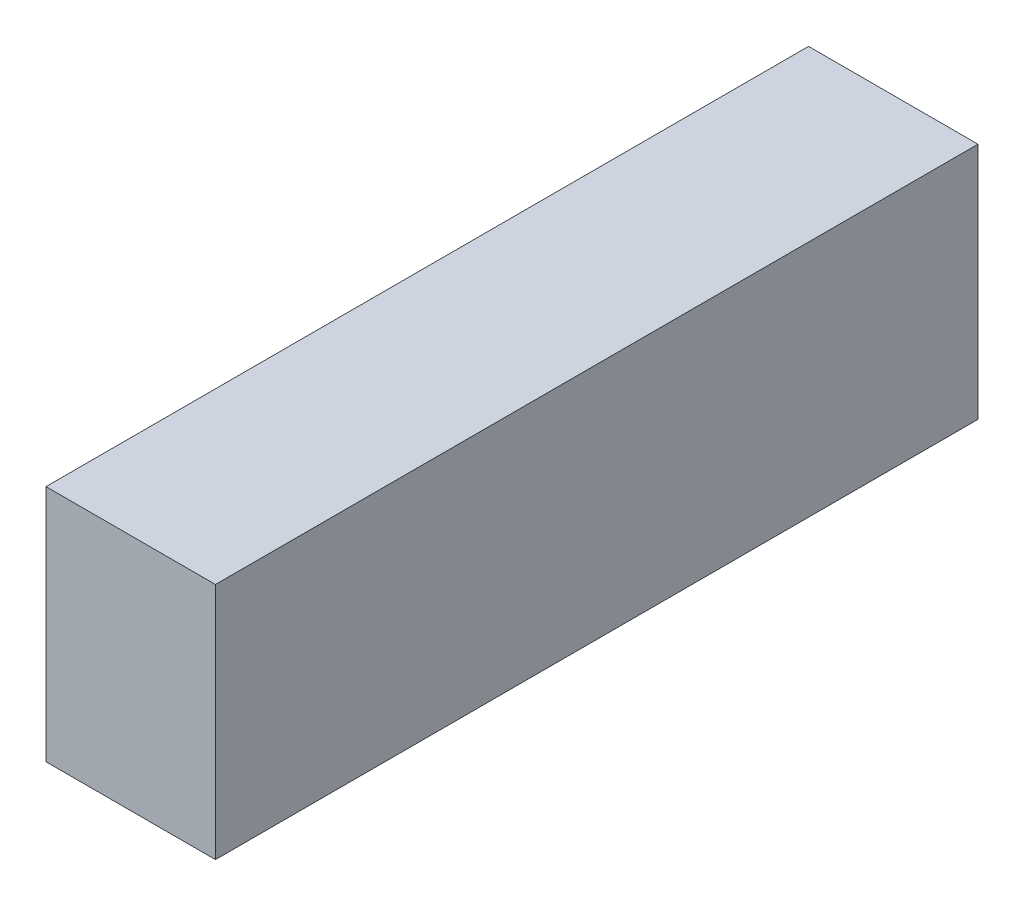
ISO-10303-21;
HEADER;
FILE_DESCRIPTION(('STEP AP214'),'2;1');
FILE_NAME('part.step','',(''),(''),'','','');
FILE_SCHEMA(('AUTOMOTIVE_DESIGN { 1 0 10303 214 1 1 1 1 }'));
ENDSEC;
DATA;
#1=APPLICATION_CONTEXT('core data for automotive mechanical design processes');
#2=APPLICATION_PROTOCOL_DEFINITION('international standard','automotive_design',2000,#1);
#3=PRODUCT_CONTEXT('',#1,'mechanical');
#4=PRODUCT('Part','Part','',(#3));
#5=PRODUCT_RELATED_PRODUCT_CATEGORY('part','',(#4));
#6=PRODUCT_DEFINITION_FORMATION('','',#4);
#7=PRODUCT_DEFINITION_CONTEXT('part definition',#1,'design');
#8=PRODUCT_DEFINITION('design','',#6,#7);
#9=PRODUCT_DEFINITION_SHAPE('','',#8);
#10=(LENGTH_UNIT() NAMED_UNIT(*) SI_UNIT(.MILLI.,.METRE.));
#11=(NAMED_UNIT(*) PLANE_ANGLE_UNIT() SI_UNIT($,.RADIAN.));
#12=(NAMED_UNIT(*) SI_UNIT($,.STERADIAN.) SOLID_ANGLE_UNIT());
#13=UNCERTAINTY_MEASURE_WITH_UNIT(LENGTH_MEASURE(1.E-05),#10,'distance_accuracy_value','');
#14=(GEOMETRIC_REPRESENTATION_CONTEXT(3) GLOBAL_UNCERTAINTY_ASSIGNED_CONTEXT((#13)) GLOBAL_UNIT_ASSIGNED_CONTEXT((#10,
#11,#12)) REPRESENTATION_CONTEXT('',''));
#15=CARTESIAN_POINT('',(0.,0.,0.));
#16=DIRECTION('',(0.,0.,1.));
#17=DIRECTION('',(1.,0.,0.));
#18=AXIS2_PLACEMENT_3D('',#15,#16,#17);
#19=CARTESIAN_POINT('',(-101.6,285.75,0.));
#20=DIRECTION('',(-1.,0.,0.));
#21=DIRECTION('',(0.,0.,1.));
#22=AXIS2_PLACEMENT_3D('',#19,#20,#21);
#23=PLANE('',#22);
#24=DIRECTION('',(0.,0.,-1.));
#25=VECTOR('',#24,1.);
#26=CARTESIAN_POINT('',(-101.6,0.,0.));
#27=LINE('',#26,#25);
#28=CARTESIAN_POINT('',(-101.6,0.,0.));
#29=VERTEX_POINT('',#28);
#30=CARTESIAN_POINT('',(-101.6,0.,-914.4));
#31=VERTEX_POINT('',#30);
#32=EDGE_CURVE('E109',#29,#31,#27,.T.);
#33=ORIENTED_EDGE('',*,*,#32,.F.);
#34=DIRECTION('',(0.,-1.,0.));
#35=VECTOR('',#34,1.);
#36=CARTESIAN_POINT('',(-101.6,285.75,0.));
#37=LINE('',#36,#35);
#38=CARTESIAN_POINT('',(-101.6,285.75,0.));
#39=VERTEX_POINT('',#38);
#40=EDGE_CURVE('E11',#39,#29,#37,.T.);
#41=ORIENTED_EDGE('',*,*,#40,.F.);
#42=DIRECTION('',(0.,0.,-1.));
#43=VECTOR('',#42,1.);
#44=CARTESIAN_POINT('',(-101.6,285.75,0.));
#45=LINE('',#44,#43);
#46=CARTESIAN_POINT('',(-101.6,285.75,-914.4));
#47=VERTEX_POINT('',#46);
#48=EDGE_CURVE('E102',#39,#47,#45,.T.);
#49=ORIENTED_EDGE('',*,*,#48,.T.);
#50=DIRECTION('',(0.,-1.,0.));
#51=VECTOR('',#50,1.);
#52=CARTESIAN_POINT('',(-101.6,285.75,-914.4));
#53=LINE('',#52,#51);
#54=EDGE_CURVE('E42',#47,#31,#53,.T.);
#55=ORIENTED_EDGE('',*,*,#54,.T.);
#56=EDGE_LOOP('',(#33,#41,#49,#55));
#57=FACE_BOUND('',#56,.T.);
#58=ADVANCED_FACE('F39',(#57),#23,.T.);
#59=CARTESIAN_POINT('',(0.,285.75,0.));
#60=DIRECTION('',(0.,0.,1.));
#61=DIRECTION('',(1.,0.,0.));
#62=AXIS2_PLACEMENT_3D('',#59,#60,#61);
#63=PLANE('',#62);
#64=DIRECTION('',(-1.,0.,0.));
#65=VECTOR('',#64,1.);
#66=CARTESIAN_POINT('',(0.,0.,0.));
#67=LINE('',#66,#65);
#68=CARTESIAN_POINT('',(101.6,0.,0.));
#69=VERTEX_POINT('',#68);
#70=EDGE_CURVE('E71',#69,#29,#67,.T.);
#71=ORIENTED_EDGE('',*,*,#70,.F.);
#72=DIRECTION('',(0.,-1.,0.));
#73=VECTOR('',#72,1.);
#74=CARTESIAN_POINT('',(101.6,285.75,0.));
#75=LINE('',#74,#73);
#76=CARTESIAN_POINT('',(101.6,285.75,0.));
#77=VERTEX_POINT('',#76);
#78=EDGE_CURVE('E49',#77,#69,#75,.T.);
#79=ORIENTED_EDGE('',*,*,#78,.F.);
#80=DIRECTION('',(1.,0.,0.));
#81=VECTOR('',#80,1.);
#82=CARTESIAN_POINT('',(0.,285.75,0.));
#83=LINE('',#82,#81);
#84=EDGE_CURVE('E57',#39,#77,#83,.T.);
#85=ORIENTED_EDGE('',*,*,#84,.F.);
#86=ORIENTED_EDGE('',*,*,#40,.T.);
#87=EDGE_LOOP('',(#71,#79,#85,#86));
#88=FACE_BOUND('',#87,.T.);
#89=ADVANCED_FACE('F126',(#88),#63,.T.);
#90=CARTESIAN_POINT('',(101.6,285.75,0.));
#91=DIRECTION('',(-1.,0.,0.));
#92=DIRECTION('',(0.,0.,1.));
#93=AXIS2_PLACEMENT_3D('',#90,#91,#92);
#94=PLANE('',#93);
#95=DIRECTION('',(0.,0.,-1.));
#96=VECTOR('',#95,1.);
#97=CARTESIAN_POINT('',(101.6,0.,0.));
#98=LINE('',#97,#96);
#99=CARTESIAN_POINT('',(101.6,0.,-914.4));
#100=VERTEX_POINT('',#99);
#101=EDGE_CURVE('E97',#69,#100,#98,.T.);
#102=ORIENTED_EDGE('',*,*,#101,.T.);
#103=DIRECTION('',(0.,-1.,0.));
#104=VECTOR('',#103,1.);
#105=CARTESIAN_POINT('',(101.6,285.75,-914.4));
#106=LINE('',#105,#104);
#107=CARTESIAN_POINT('',(101.6,285.75,-914.4));
#108=VERTEX_POINT('',#107);
#109=EDGE_CURVE('E94',#108,#100,#106,.T.);
#110=ORIENTED_EDGE('',*,*,#109,.F.);
#111=DIRECTION('',(0.,0.,-1.));
#112=VECTOR('',#111,1.);
#113=CARTESIAN_POINT('',(101.6,285.75,0.));
#114=LINE('',#113,#112);
#115=EDGE_CURVE('E84',#77,#108,#114,.T.);
#116=ORIENTED_EDGE('',*,*,#115,.F.);
#117=ORIENTED_EDGE('',*,*,#78,.T.);
#118=EDGE_LOOP('',(#102,#110,#116,#117));
#119=FACE_BOUND('',#118,.T.);
#120=ADVANCED_FACE('F95',(#119),#94,.F.);
#121=CARTESIAN_POINT('',(-101.6,285.75,-914.4));
#122=DIRECTION('',(0.,0.,-1.));
#123=DIRECTION('',(-1.,0.,0.));
#124=AXIS2_PLACEMENT_3D('',#121,#122,#123);
#125=PLANE('',#124);
#126=DIRECTION('',(1.,0.,0.));
#127=VECTOR('',#126,1.);
#128=CARTESIAN_POINT('',(-101.6,0.,-914.4));
#129=LINE('',#128,#127);
#130=EDGE_CURVE('E113',#31,#100,#129,.T.);
#131=ORIENTED_EDGE('',*,*,#130,.F.);
#132=ORIENTED_EDGE('',*,*,#54,.F.);
#133=DIRECTION('',(1.,0.,0.));
#134=VECTOR('',#133,1.);
#135=CARTESIAN_POINT('',(-101.6,285.75,-914.4));
#136=LINE('',#135,#134);
#137=EDGE_CURVE('E88',#47,#108,#136,.T.);
#138=ORIENTED_EDGE('',*,*,#137,.T.);
#139=ORIENTED_EDGE('',*,*,#109,.T.);
#140=EDGE_LOOP('',(#131,#132,#138,#139));
#141=FACE_BOUND('',#140,.T.);
#142=ADVANCED_FACE('F100',(#141),#125,.T.);
#143=CARTESIAN_POINT('',(0.,285.75,0.));
#144=DIRECTION('',(0.,-1.,0.));
#145=DIRECTION('',(0.,0.,-1.));
#146=AXIS2_PLACEMENT_3D('',#143,#144,#145);
#147=PLANE('',#146);
#148=ORIENTED_EDGE('',*,*,#48,.F.);
#149=ORIENTED_EDGE('',*,*,#84,.T.);
#150=ORIENTED_EDGE('',*,*,#115,.T.);
#151=ORIENTED_EDGE('',*,*,#137,.F.);
#152=EDGE_LOOP('',(#148,#149,#150,#151));
#153=FACE_BOUND('',#152,.T.);
#154=ADVANCED_FACE('F87',(#153),#147,.F.);
#155=CARTESIAN_POINT('',(0.,0.,0.));
#156=DIRECTION('',(0.,-1.,0.));
#157=DIRECTION('',(0.,0.,-1.));
#158=AXIS2_PLACEMENT_3D('',#155,#156,#157);
#159=PLANE('',#158);
#160=ORIENTED_EDGE('',*,*,#32,.T.);
#161=ORIENTED_EDGE('',*,*,#130,.T.);
#162=ORIENTED_EDGE('',*,*,#101,.F.);
#163=ORIENTED_EDGE('',*,*,#70,.T.);
#164=EDGE_LOOP('',(#160,#161,#162,#163));
#165=FACE_BOUND('',#164,.T.);
#166=ADVANCED_FACE('F122',(#165),#159,.T.);
#167=CLOSED_SHELL('',(#58,#89,#120,#142,#154,#166));
#168=MANIFOLD_SOLID_BREP('B2',#167);
#169=ADVANCED_BREP_SHAPE_REPRESENTATION('',(#18,#168),#14);
#170=SHAPE_DEFINITION_REPRESENTATION(#9,#169);
ENDSEC;
END-ISO-10303-21;
